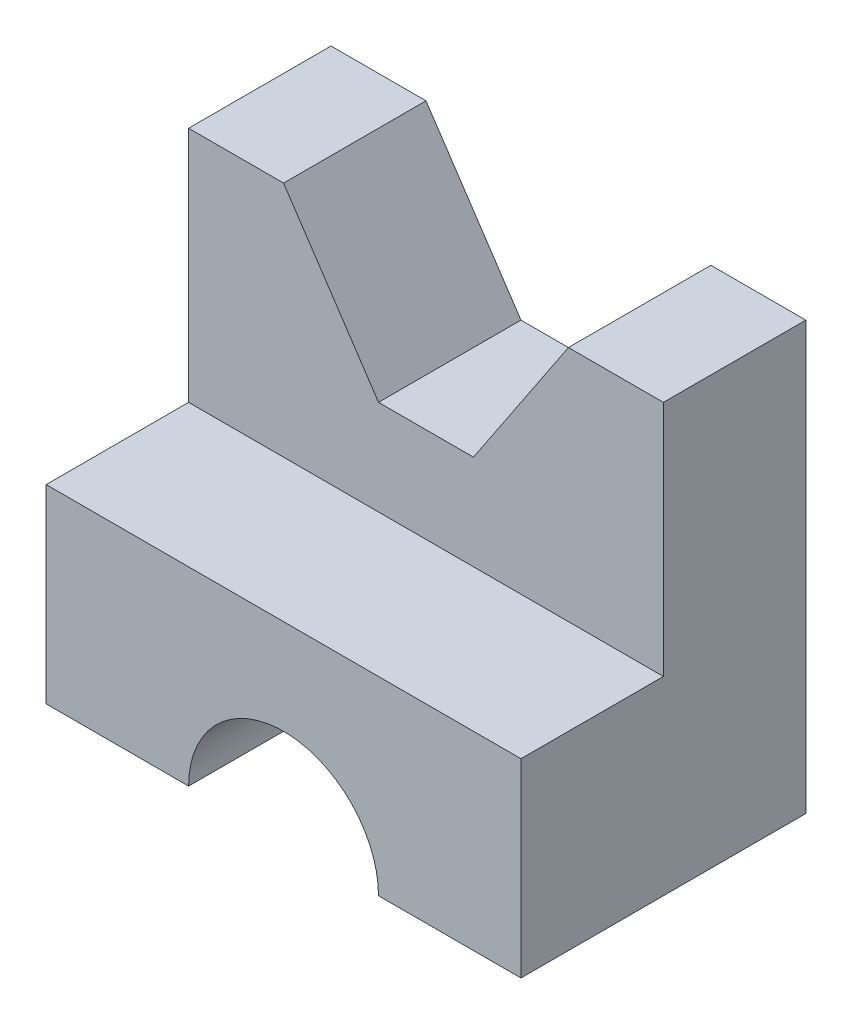
ISO-10303-21;
HEADER;
FILE_DESCRIPTION(('STEP AP214'),'2;1');
FILE_NAME('part.step','',(''),(''),'','','');
FILE_SCHEMA(('AUTOMOTIVE_DESIGN { 1 0 10303 214 1 1 1 1 }'));
ENDSEC;
DATA;
#1=APPLICATION_CONTEXT('core data for automotive mechanical design processes');
#2=APPLICATION_PROTOCOL_DEFINITION('international standard','automotive_design',2000,#1);
#3=PRODUCT_CONTEXT('',#1,'mechanical');
#4=PRODUCT('Part','Part','',(#3));
#5=PRODUCT_RELATED_PRODUCT_CATEGORY('part','',(#4));
#6=PRODUCT_DEFINITION_FORMATION('','',#4);
#7=PRODUCT_DEFINITION_CONTEXT('part definition',#1,'design');
#8=PRODUCT_DEFINITION('design','',#6,#7);
#9=PRODUCT_DEFINITION_SHAPE('','',#8);
#10=(LENGTH_UNIT() NAMED_UNIT(*) SI_UNIT(.MILLI.,.METRE.));
#11=(NAMED_UNIT(*) PLANE_ANGLE_UNIT() SI_UNIT($,.RADIAN.));
#12=(NAMED_UNIT(*) SI_UNIT($,.STERADIAN.) SOLID_ANGLE_UNIT());
#13=UNCERTAINTY_MEASURE_WITH_UNIT(LENGTH_MEASURE(1.E-05),#10,'distance_accuracy_value','');
#14=(GEOMETRIC_REPRESENTATION_CONTEXT(3) GLOBAL_UNCERTAINTY_ASSIGNED_CONTEXT((#13)) GLOBAL_UNIT_ASSIGNED_CONTEXT((#10,
#11,#12)) REPRESENTATION_CONTEXT('',''));
#15=CARTESIAN_POINT('',(0.,0.,0.));
#16=DIRECTION('',(0.,0.,1.));
#17=DIRECTION('',(1.,0.,0.));
#18=AXIS2_PLACEMENT_3D('',#15,#16,#17);
#19=CARTESIAN_POINT('',(25.,0.,0.));
#20=DIRECTION('',(0.,0.,1.));
#21=DIRECTION('',(0.,-1.,0.));
#22=AXIS2_PLACEMENT_3D('',#19,#20,#21);
#23=PLANE('',#22);
#24=CARTESIAN_POINT('',(0.,0.,0.));
#25=DIRECTION('',(0.,0.,1.));
#26=DIRECTION('',(1.,0.,0.));
#27=AXIS2_PLACEMENT_3D('',#24,#25,#26);
#28=CIRCLE('',#27,10.);
#29=CARTESIAN_POINT('',(10.,0.,0.));
#30=VERTEX_POINT('',#29);
#31=CARTESIAN_POINT('',(-10.,0.,0.));
#32=VERTEX_POINT('',#31);
#33=EDGE_CURVE('E123',#30,#32,#28,.T.);
#34=ORIENTED_EDGE('',*,*,#33,.T.);
#35=DIRECTION('',(-1.,0.,0.));
#36=VECTOR('',#35,1.);
#37=CARTESIAN_POINT('',(25.,0.,0.));
#38=LINE('',#37,#36);
#39=CARTESIAN_POINT('',(-25.,0.,0.));
#40=VERTEX_POINT('',#39);
#41=EDGE_CURVE('E41',#32,#40,#38,.T.);
#42=ORIENTED_EDGE('',*,*,#41,.T.);
#43=DIRECTION('',(0.,1.,0.));
#44=VECTOR('',#43,1.);
#45=CARTESIAN_POINT('',(-25.,0.,0.));
#46=LINE('',#45,#44);
#47=CARTESIAN_POINT('',(-25.,45.,0.));
#48=VERTEX_POINT('',#47);
#49=EDGE_CURVE('E172',#40,#48,#46,.T.);
#50=ORIENTED_EDGE('',*,*,#49,.T.);
#51=DIRECTION('',(-1.,0.,0.));
#52=VECTOR('',#51,1.);
#53=CARTESIAN_POINT('',(25.,45.,0.));
#54=LINE('',#53,#52);
#55=CARTESIAN_POINT('',(-15.,45.,0.));
#56=VERTEX_POINT('',#55);
#57=EDGE_CURVE('E141',#56,#48,#54,.T.);
#58=ORIENTED_EDGE('',*,*,#57,.F.);
#59=DIRECTION('',(0.554700196225229,-0.832050294337844,0.));
#60=VECTOR('',#59,1.);
#61=CARTESIAN_POINT('',(-15.,45.,0.));
#62=LINE('',#61,#60);
#63=CARTESIAN_POINT('',(-5.,30.,0.));
#64=VERTEX_POINT('',#63);
#65=EDGE_CURVE('E204',#56,#64,#62,.T.);
#66=ORIENTED_EDGE('',*,*,#65,.T.);
#67=DIRECTION('',(1.,0.,0.));
#68=VECTOR('',#67,1.);
#69=CARTESIAN_POINT('',(-5.,30.,0.));
#70=LINE('',#69,#68);
#71=CARTESIAN_POINT('',(5.,30.,0.));
#72=VERTEX_POINT('',#71);
#73=EDGE_CURVE('E201',#64,#72,#70,.T.);
#74=ORIENTED_EDGE('',*,*,#73,.T.);
#75=DIRECTION('',(0.554700196225229,0.832050294337844,0.));
#76=VECTOR('',#75,1.);
#77=CARTESIAN_POINT('',(5.,30.,0.));
#78=LINE('',#77,#76);
#79=CARTESIAN_POINT('',(15.,45.,0.));
#80=VERTEX_POINT('',#79);
#81=EDGE_CURVE('E198',#72,#80,#78,.T.);
#82=ORIENTED_EDGE('',*,*,#81,.T.);
#83=CARTESIAN_POINT('',(25.,45.,0.));
#84=VERTEX_POINT('',#83);
#85=EDGE_CURVE('E139',#84,#80,#54,.T.);
#86=ORIENTED_EDGE('',*,*,#85,.F.);
#87=DIRECTION('',(0.,1.,0.));
#88=VECTOR('',#87,1.);
#89=CARTESIAN_POINT('',(25.,0.,0.));
#90=LINE('',#89,#88);
#91=CARTESIAN_POINT('',(25.,0.,0.));
#92=VERTEX_POINT('',#91);
#93=EDGE_CURVE('E184',#92,#84,#90,.T.);
#94=ORIENTED_EDGE('',*,*,#93,.F.);
#95=EDGE_CURVE('E11',#92,#30,#38,.T.);
#96=ORIENTED_EDGE('',*,*,#95,.T.);
#97=EDGE_LOOP('',(#34,#42,#50,#58,#66,#74,#82,#86,#94,#96));
#98=FACE_BOUND('',#97,.T.);
#99=ADVANCED_FACE('F33',(#98),#23,.F.);
#100=CARTESIAN_POINT('',(25.,0.,30.));
#101=DIRECTION('',(0.,1.,0.));
#102=DIRECTION('',(0.,0.,1.));
#103=AXIS2_PLACEMENT_3D('',#100,#101,#102);
#104=PLANE('',#103);
#105=DIRECTION('',(0.,0.,-1.));
#106=VECTOR('',#105,1.);
#107=CARTESIAN_POINT('',(10.,0.,30.001));
#108=LINE('',#107,#106);
#109=CARTESIAN_POINT('',(10.,0.,30.));
#110=VERTEX_POINT('',#109);
#111=EDGE_CURVE('E48',#110,#30,#108,.T.);
#112=ORIENTED_EDGE('',*,*,#111,.T.);
#113=ORIENTED_EDGE('',*,*,#95,.F.);
#114=DIRECTION('',(0.,0.,-1.));
#115=VECTOR('',#114,1.);
#116=CARTESIAN_POINT('',(25.,0.,30.));
#117=LINE('',#116,#115);
#118=CARTESIAN_POINT('',(25.,0.,30.));
#119=VERTEX_POINT('',#118);
#120=EDGE_CURVE('E164',#119,#92,#117,.T.);
#121=ORIENTED_EDGE('',*,*,#120,.F.);
#122=DIRECTION('',(-1.,0.,0.));
#123=VECTOR('',#122,1.);
#124=CARTESIAN_POINT('',(25.,0.,30.));
#125=LINE('',#124,#123);
#126=EDGE_CURVE('E157',#119,#110,#125,.T.);
#127=ORIENTED_EDGE('',*,*,#126,.T.);
#128=EDGE_LOOP('',(#112,#113,#121,#127));
#129=FACE_BOUND('',#128,.T.);
#130=ADVANCED_FACE('F35',(#129),#104,.F.);
#131=DIRECTION('',(0.,0.,-1.));
#132=VECTOR('',#131,1.);
#133=CARTESIAN_POINT('',(-10.,0.,30.001));
#134=LINE('',#133,#132);
#135=CARTESIAN_POINT('',(-10.,0.,30.));
#136=VERTEX_POINT('',#135);
#137=EDGE_CURVE('E120',#136,#32,#134,.T.);
#138=ORIENTED_EDGE('',*,*,#137,.F.);
#139=CARTESIAN_POINT('',(-25.,0.,30.));
#140=VERTEX_POINT('',#139);
#141=EDGE_CURVE('E160',#136,#140,#125,.T.);
#142=ORIENTED_EDGE('',*,*,#141,.T.);
#143=DIRECTION('',(0.,0.,-1.));
#144=VECTOR('',#143,1.);
#145=CARTESIAN_POINT('',(-25.,0.,30.));
#146=LINE('',#145,#144);
#147=EDGE_CURVE('E138',#140,#40,#146,.T.);
#148=ORIENTED_EDGE('',*,*,#147,.T.);
#149=ORIENTED_EDGE('',*,*,#41,.F.);
#150=EDGE_LOOP('',(#138,#142,#148,#149));
#151=FACE_BOUND('',#150,.T.);
#152=ADVANCED_FACE('F136',(#151),#104,.F.);
#153=CARTESIAN_POINT('',(25.,20.,30.));
#154=DIRECTION('',(0.,0.,-1.));
#155=DIRECTION('',(-1.,0.,0.));
#156=AXIS2_PLACEMENT_3D('',#153,#154,#155);
#157=PLANE('',#156);
#158=CARTESIAN_POINT('',(0.,0.,30.));
#159=DIRECTION('',(0.,0.,-1.));
#160=DIRECTION('',(-1.,0.,0.));
#161=AXIS2_PLACEMENT_3D('',#158,#159,#160);
#162=CIRCLE('',#161,10.);
#163=EDGE_CURVE('E124',#136,#110,#162,.T.);
#164=ORIENTED_EDGE('',*,*,#163,.T.);
#165=ORIENTED_EDGE('',*,*,#126,.F.);
#166=DIRECTION('',(0.,-1.,0.));
#167=VECTOR('',#166,1.);
#168=CARTESIAN_POINT('',(25.,20.,30.));
#169=LINE('',#168,#167);
#170=CARTESIAN_POINT('',(25.,20.,30.));
#171=VERTEX_POINT('',#170);
#172=EDGE_CURVE('E176',#171,#119,#169,.T.);
#173=ORIENTED_EDGE('',*,*,#172,.F.);
#174=DIRECTION('',(-1.,0.,0.));
#175=VECTOR('',#174,1.);
#176=CARTESIAN_POINT('',(25.,20.,30.));
#177=LINE('',#176,#175);
#178=CARTESIAN_POINT('',(-25.,20.,30.));
#179=VERTEX_POINT('',#178);
#180=EDGE_CURVE('E154',#171,#179,#177,.T.);
#181=ORIENTED_EDGE('',*,*,#180,.T.);
#182=DIRECTION('',(0.,-1.,0.));
#183=VECTOR('',#182,1.);
#184=CARTESIAN_POINT('',(-25.,20.,30.));
#185=LINE('',#184,#183);
#186=EDGE_CURVE('E161',#179,#140,#185,.T.);
#187=ORIENTED_EDGE('',*,*,#186,.T.);
#188=ORIENTED_EDGE('',*,*,#141,.F.);
#189=EDGE_LOOP('',(#164,#165,#173,#181,#187,#188));
#190=FACE_BOUND('',#189,.T.);
#191=ADVANCED_FACE('F215',(#190),#157,.F.);
#192=CARTESIAN_POINT('',(25.,45.,0.));
#193=DIRECTION('',(0.,-1.,0.));
#194=DIRECTION('',(0.,0.,-1.));
#195=AXIS2_PLACEMENT_3D('',#192,#193,#194);
#196=PLANE('',#195);
#197=DIRECTION('',(0.,0.,-1.));
#198=VECTOR('',#197,1.);
#199=CARTESIAN_POINT('',(-15.,45.,30.001));
#200=LINE('',#199,#198);
#201=CARTESIAN_POINT('',(-15.,45.,15.));
#202=VERTEX_POINT('',#201);
#203=EDGE_CURVE('E190',#202,#56,#200,.T.);
#204=ORIENTED_EDGE('',*,*,#203,.T.);
#205=ORIENTED_EDGE('',*,*,#57,.T.);
#206=DIRECTION('',(0.,0.,1.));
#207=VECTOR('',#206,1.);
#208=CARTESIAN_POINT('',(-25.,45.,0.));
#209=LINE('',#208,#207);
#210=CARTESIAN_POINT('',(-25.,45.,15.));
#211=VERTEX_POINT('',#210);
#212=EDGE_CURVE('E169',#48,#211,#209,.T.);
#213=ORIENTED_EDGE('',*,*,#212,.T.);
#214=DIRECTION('',(-1.,0.,0.));
#215=VECTOR('',#214,1.);
#216=CARTESIAN_POINT('',(25.,45.,15.));
#217=LINE('',#216,#215);
#218=EDGE_CURVE('E150',#202,#211,#217,.T.);
#219=ORIENTED_EDGE('',*,*,#218,.F.);
#220=EDGE_LOOP('',(#204,#205,#213,#219));
#221=FACE_BOUND('',#220,.T.);
#222=ADVANCED_FACE('F232',(#221),#196,.F.);
#223=DIRECTION('',(0.,0.,-1.));
#224=VECTOR('',#223,1.);
#225=CARTESIAN_POINT('',(15.,45.,30.001));
#226=LINE('',#225,#224);
#227=CARTESIAN_POINT('',(15.,45.,15.));
#228=VERTEX_POINT('',#227);
#229=EDGE_CURVE('E196',#228,#80,#226,.T.);
#230=ORIENTED_EDGE('',*,*,#229,.F.);
#231=CARTESIAN_POINT('',(25.,45.,15.));
#232=VERTEX_POINT('',#231);
#233=EDGE_CURVE('E146',#232,#228,#217,.T.);
#234=ORIENTED_EDGE('',*,*,#233,.F.);
#235=DIRECTION('',(0.,0.,1.));
#236=VECTOR('',#235,1.);
#237=CARTESIAN_POINT('',(25.,45.,0.));
#238=LINE('',#237,#236);
#239=EDGE_CURVE('E182',#84,#232,#238,.T.);
#240=ORIENTED_EDGE('',*,*,#239,.F.);
#241=ORIENTED_EDGE('',*,*,#85,.T.);
#242=EDGE_LOOP('',(#230,#234,#240,#241));
#243=FACE_BOUND('',#242,.T.);
#244=ADVANCED_FACE('F244',(#243),#196,.F.);
#245=CARTESIAN_POINT('',(25.,45.,15.));
#246=DIRECTION('',(0.,0.,-1.));
#247=DIRECTION('',(0.,1.,0.));
#248=AXIS2_PLACEMENT_3D('',#245,#246,#247);
#249=PLANE('',#248);
#250=DIRECTION('',(-0.554700196225229,0.832050294337844,0.));
#251=VECTOR('',#250,1.);
#252=CARTESIAN_POINT('',(-15.,45.,15.));
#253=LINE('',#252,#251);
#254=CARTESIAN_POINT('',(-5.,30.,15.));
#255=VERTEX_POINT('',#254);
#256=EDGE_CURVE('E207',#255,#202,#253,.T.);
#257=ORIENTED_EDGE('',*,*,#256,.T.);
#258=ORIENTED_EDGE('',*,*,#218,.T.);
#259=DIRECTION('',(0.,-1.,0.));
#260=VECTOR('',#259,1.);
#261=CARTESIAN_POINT('',(-25.,45.,15.));
#262=LINE('',#261,#260);
#263=CARTESIAN_POINT('',(-25.,20.,15.));
#264=VERTEX_POINT('',#263);
#265=EDGE_CURVE('E167',#211,#264,#262,.T.);
#266=ORIENTED_EDGE('',*,*,#265,.T.);
#267=DIRECTION('',(-1.,0.,0.));
#268=VECTOR('',#267,1.);
#269=CARTESIAN_POINT('',(25.,20.,15.));
#270=LINE('',#269,#268);
#271=CARTESIAN_POINT('',(25.,20.,15.));
#272=VERTEX_POINT('',#271);
#273=EDGE_CURVE('E151',#272,#264,#270,.T.);
#274=ORIENTED_EDGE('',*,*,#273,.F.);
#275=DIRECTION('',(0.,-1.,0.));
#276=VECTOR('',#275,1.);
#277=CARTESIAN_POINT('',(25.,45.,15.));
#278=LINE('',#277,#276);
#279=EDGE_CURVE('E180',#232,#272,#278,.T.);
#280=ORIENTED_EDGE('',*,*,#279,.F.);
#281=ORIENTED_EDGE('',*,*,#233,.T.);
#282=DIRECTION('',(-0.554700196225229,-0.832050294337844,0.));
#283=VECTOR('',#282,1.);
#284=CARTESIAN_POINT('',(5.,30.,15.));
#285=LINE('',#284,#283);
#286=CARTESIAN_POINT('',(5.,30.,15.));
#287=VERTEX_POINT('',#286);
#288=EDGE_CURVE('E175',#228,#287,#285,.T.);
#289=ORIENTED_EDGE('',*,*,#288,.T.);
#290=DIRECTION('',(-1.,0.,0.));
#291=VECTOR('',#290,1.);
#292=CARTESIAN_POINT('',(-5.,30.,15.));
#293=LINE('',#292,#291);
#294=EDGE_CURVE('E128',#287,#255,#293,.T.);
#295=ORIENTED_EDGE('',*,*,#294,.T.);
#296=EDGE_LOOP('',(#257,#258,#266,#274,#280,#281,#289,#295));
#297=FACE_BOUND('',#296,.T.);
#298=ADVANCED_FACE('F238',(#297),#249,.F.);
#299=CARTESIAN_POINT('',(25.,20.,15.));
#300=DIRECTION('',(0.,-1.,0.));
#301=DIRECTION('',(0.,0.,-1.));
#302=AXIS2_PLACEMENT_3D('',#299,#300,#301);
#303=PLANE('',#302);
#304=DIRECTION('',(0.,0.,1.));
#305=VECTOR('',#304,1.);
#306=CARTESIAN_POINT('',(-25.,20.,15.));
#307=LINE('',#306,#305);
#308=EDGE_CURVE('E165',#264,#179,#307,.T.);
#309=ORIENTED_EDGE('',*,*,#308,.T.);
#310=ORIENTED_EDGE('',*,*,#180,.F.);
#311=DIRECTION('',(0.,0.,1.));
#312=VECTOR('',#311,1.);
#313=CARTESIAN_POINT('',(25.,20.,15.));
#314=LINE('',#313,#312);
#315=EDGE_CURVE('E178',#272,#171,#314,.T.);
#316=ORIENTED_EDGE('',*,*,#315,.F.);
#317=ORIENTED_EDGE('',*,*,#273,.T.);
#318=EDGE_LOOP('',(#309,#310,#316,#317));
#319=FACE_BOUND('',#318,.T.);
#320=ADVANCED_FACE('F247',(#319),#303,.F.);
#321=CARTESIAN_POINT('',(25.,0.,0.));
#322=DIRECTION('',(1.,0.,0.));
#323=DIRECTION('',(0.,0.,-1.));
#324=AXIS2_PLACEMENT_3D('',#321,#322,#323);
#325=PLANE('',#324);
#326=ORIENTED_EDGE('',*,*,#120,.T.);
#327=ORIENTED_EDGE('',*,*,#93,.T.);
#328=ORIENTED_EDGE('',*,*,#239,.T.);
#329=ORIENTED_EDGE('',*,*,#279,.T.);
#330=ORIENTED_EDGE('',*,*,#315,.T.);
#331=ORIENTED_EDGE('',*,*,#172,.T.);
#332=EDGE_LOOP('',(#326,#327,#328,#329,#330,#331));
#333=FACE_BOUND('',#332,.T.);
#334=ADVANCED_FACE('F220',(#333),#325,.T.);
#335=CARTESIAN_POINT('',(-25.,0.,0.));
#336=DIRECTION('',(1.,0.,0.));
#337=DIRECTION('',(0.,0.,-1.));
#338=AXIS2_PLACEMENT_3D('',#335,#336,#337);
#339=PLANE('',#338);
#340=ORIENTED_EDGE('',*,*,#147,.F.);
#341=ORIENTED_EDGE('',*,*,#186,.F.);
#342=ORIENTED_EDGE('',*,*,#308,.F.);
#343=ORIENTED_EDGE('',*,*,#265,.F.);
#344=ORIENTED_EDGE('',*,*,#212,.F.);
#345=ORIENTED_EDGE('',*,*,#49,.F.);
#346=EDGE_LOOP('',(#340,#341,#342,#343,#344,#345));
#347=FACE_BOUND('',#346,.T.);
#348=ADVANCED_FACE('F227',(#347),#339,.F.);
#349=CARTESIAN_POINT('',(-15.,45.,30.001));
#350=DIRECTION('',(0.832050294337844,0.554700196225229,0.));
#351=DIRECTION('',(-0.554700196225229,0.832050294337844,0.));
#352=AXIS2_PLACEMENT_3D('',#349,#350,#351);
#353=PLANE('',#352);
#354=DIRECTION('',(0.,0.,-1.));
#355=VECTOR('',#354,1.);
#356=CARTESIAN_POINT('',(-5.,30.,30.001));
#357=LINE('',#356,#355);
#358=EDGE_CURVE('E193',#255,#64,#357,.T.);
#359=ORIENTED_EDGE('',*,*,#358,.T.);
#360=ORIENTED_EDGE('',*,*,#65,.F.);
#361=ORIENTED_EDGE('',*,*,#203,.F.);
#362=ORIENTED_EDGE('',*,*,#256,.F.);
#363=EDGE_LOOP('',(#359,#360,#361,#362));
#364=FACE_BOUND('',#363,.T.);
#365=ADVANCED_FACE('F235',(#364),#353,.T.);
#366=CARTESIAN_POINT('',(-5.,30.,30.001));
#367=DIRECTION('',(0.,1.,0.));
#368=DIRECTION('',(0.,0.,1.));
#369=AXIS2_PLACEMENT_3D('',#366,#367,#368);
#370=PLANE('',#369);
#371=DIRECTION('',(0.,0.,-1.));
#372=VECTOR('',#371,1.);
#373=CARTESIAN_POINT('',(5.,30.,30.001));
#374=LINE('',#373,#372);
#375=EDGE_CURVE('E56',#287,#72,#374,.T.);
#376=ORIENTED_EDGE('',*,*,#375,.T.);
#377=ORIENTED_EDGE('',*,*,#73,.F.);
#378=ORIENTED_EDGE('',*,*,#358,.F.);
#379=ORIENTED_EDGE('',*,*,#294,.F.);
#380=EDGE_LOOP('',(#376,#377,#378,#379));
#381=FACE_BOUND('',#380,.T.);
#382=ADVANCED_FACE('F240',(#381),#370,.T.);
#383=CARTESIAN_POINT('',(5.,30.,30.001));
#384=DIRECTION('',(-0.832050294337844,0.554700196225229,0.));
#385=DIRECTION('',(-0.554700196225229,-0.832050294337844,0.));
#386=AXIS2_PLACEMENT_3D('',#383,#384,#385);
#387=PLANE('',#386);
#388=ORIENTED_EDGE('',*,*,#229,.T.);
#389=ORIENTED_EDGE('',*,*,#81,.F.);
#390=ORIENTED_EDGE('',*,*,#375,.F.);
#391=ORIENTED_EDGE('',*,*,#288,.F.);
#392=EDGE_LOOP('',(#388,#389,#390,#391));
#393=FACE_BOUND('',#392,.T.);
#394=ADVANCED_FACE('F242',(#393),#387,.T.);
#395=CARTESIAN_POINT('',(0.,0.,30.001));
#396=DIRECTION('',(0.,0.,-1.));
#397=DIRECTION('',(-1.,0.,0.));
#398=AXIS2_PLACEMENT_3D('',#395,#396,#397);
#399=CYLINDRICAL_SURFACE('',#398,10.);
#400=ORIENTED_EDGE('',*,*,#137,.T.);
#401=ORIENTED_EDGE('',*,*,#33,.F.);
#402=ORIENTED_EDGE('',*,*,#111,.F.);
#403=ORIENTED_EDGE('',*,*,#163,.F.);
#404=EDGE_LOOP('',(#400,#401,#402,#403));
#405=FACE_BOUND('',#404,.T.);
#406=ADVANCED_FACE('F122',(#405),#399,.F.);
#407=CLOSED_SHELL('',(#99,#130,#152,#191,#222,#244,#298,#320,#334,#348,#365,#382,#394,#406));
#408=MANIFOLD_SOLID_BREP('B2',#407);
#409=ADVANCED_BREP_SHAPE_REPRESENTATION('',(#18,#408),#14);
#410=SHAPE_DEFINITION_REPRESENTATION(#9,#409);
ENDSEC;
END-ISO-10303-21;
